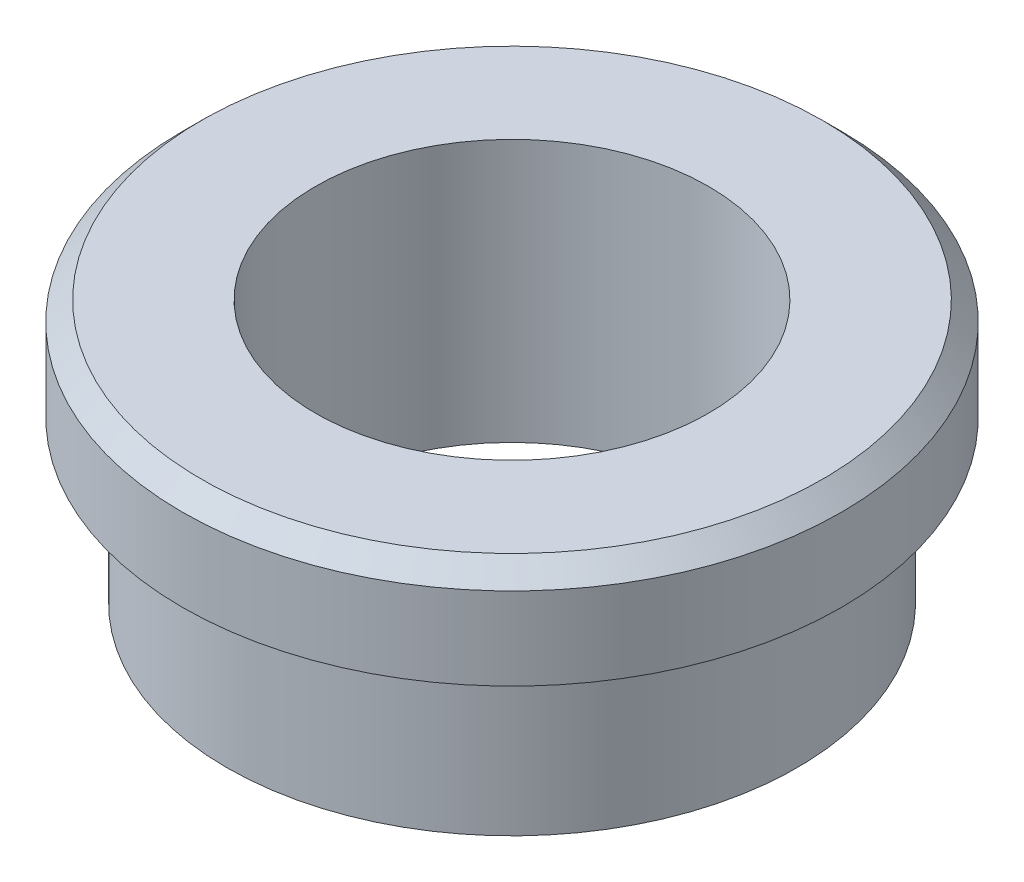
ISO-10303-21;
HEADER;
FILE_DESCRIPTION(('STEP AP214'),'2;1');
FILE_NAME('part.step','',(''),(''),'','','');
FILE_SCHEMA(('AUTOMOTIVE_DESIGN { 1 0 10303 214 1 1 1 1 }'));
ENDSEC;
DATA;
#1=APPLICATION_CONTEXT('core data for automotive mechanical design processes');
#2=APPLICATION_PROTOCOL_DEFINITION('international standard','automotive_design',2000,#1);
#3=PRODUCT_CONTEXT('',#1,'mechanical');
#4=PRODUCT('Part','Part','',(#3));
#5=PRODUCT_RELATED_PRODUCT_CATEGORY('part','',(#4));
#6=PRODUCT_DEFINITION_FORMATION('','',#4);
#7=PRODUCT_DEFINITION_CONTEXT('part definition',#1,'design');
#8=PRODUCT_DEFINITION('design','',#6,#7);
#9=PRODUCT_DEFINITION_SHAPE('','',#8);
#10=(LENGTH_UNIT() NAMED_UNIT(*) SI_UNIT(.MILLI.,.METRE.));
#11=(NAMED_UNIT(*) PLANE_ANGLE_UNIT() SI_UNIT($,.RADIAN.));
#12=(NAMED_UNIT(*) SI_UNIT($,.STERADIAN.) SOLID_ANGLE_UNIT());
#13=UNCERTAINTY_MEASURE_WITH_UNIT(LENGTH_MEASURE(1.E-05),#10,'distance_accuracy_value','');
#14=(GEOMETRIC_REPRESENTATION_CONTEXT(3) GLOBAL_UNCERTAINTY_ASSIGNED_CONTEXT((#13)) GLOBAL_UNIT_ASSIGNED_CONTEXT((#10,
#11,#12)) REPRESENTATION_CONTEXT('',''));
#15=CARTESIAN_POINT('',(0.,0.,0.));
#16=DIRECTION('',(0.,0.,1.));
#17=DIRECTION('',(1.,0.,0.));
#18=AXIS2_PLACEMENT_3D('',#15,#16,#17);
#19=CARTESIAN_POINT('',(22.5,0.,0.));
#20=DIRECTION('',(0.,-1.,0.));
#21=DIRECTION('',(0.,0.,-1.));
#22=AXIS2_PLACEMENT_3D('',#19,#20,#21);
#23=PLANE('',#22);
#24=CARTESIAN_POINT('',(0.,0.,0.));
#25=DIRECTION('',(0.,-1.,0.));
#26=DIRECTION('',(0.,0.,-1.));
#27=AXIS2_PLACEMENT_3D('',#24,#25,#26);
#28=CIRCLE('',#27,22.5);
#29=CARTESIAN_POINT('',(0.,0.,-22.5));
#30=VERTEX_POINT('',#29);
#31=EDGE_CURVE('E62',#30,#30,#28,.T.);
#32=ORIENTED_EDGE('',*,*,#31,.T.);
#33=EDGE_LOOP('',(#32));
#34=FACE_BOUND('',#33,.T.);
#35=CARTESIAN_POINT('',(0.,0.,0.));
#36=DIRECTION('',(0.,-1.,0.));
#37=DIRECTION('',(0.,0.,-1.));
#38=AXIS2_PLACEMENT_3D('',#35,#36,#37);
#39=CIRCLE('',#38,15.5);
#40=CARTESIAN_POINT('',(0.,0.,-15.5));
#41=VERTEX_POINT('',#40);
#42=EDGE_CURVE('E10',#41,#41,#39,.T.);
#43=ORIENTED_EDGE('',*,*,#42,.F.);
#44=EDGE_LOOP('',(#43));
#45=FACE_BOUND('',#44,.T.);
#46=ADVANCED_FACE('F37',(#34,#45),#23,.T.);
#47=CARTESIAN_POINT('',(0.,0.,0.));
#48=DIRECTION('',(0.,-1.,0.));
#49=DIRECTION('',(0.,0.,-1.));
#50=AXIS2_PLACEMENT_3D('',#47,#48,#49);
#51=CYLINDRICAL_SURFACE('',#50,15.5);
#52=ORIENTED_EDGE('',*,*,#42,.T.);
#53=EDGE_LOOP('',(#52));
#54=FACE_BOUND('',#53,.T.);
#55=CARTESIAN_POINT('',(0.,20.7,0.));
#56=DIRECTION('',(0.,-1.,0.));
#57=DIRECTION('',(0.,0.,-1.));
#58=AXIS2_PLACEMENT_3D('',#55,#56,#57);
#59=CIRCLE('',#58,15.5);
#60=CARTESIAN_POINT('',(0.,20.7,-15.5));
#61=VERTEX_POINT('',#60);
#62=EDGE_CURVE('E43',#61,#61,#59,.T.);
#63=ORIENTED_EDGE('',*,*,#62,.F.);
#64=EDGE_LOOP('',(#63));
#65=FACE_BOUND('',#64,.T.);
#66=ADVANCED_FACE('F80',(#54,#65),#51,.F.);
#67=CARTESIAN_POINT('',(15.5,20.7,0.));
#68=DIRECTION('',(0.,1.,0.));
#69=DIRECTION('',(0.,0.,1.));
#70=AXIS2_PLACEMENT_3D('',#67,#68,#69);
#71=PLANE('',#70);
#72=ORIENTED_EDGE('',*,*,#62,.T.);
#73=EDGE_LOOP('',(#72));
#74=FACE_BOUND('',#73,.T.);
#75=CARTESIAN_POINT('',(0.,20.7,0.));
#76=DIRECTION('',(0.,-1.,0.));
#77=DIRECTION('',(0.,0.,-1.));
#78=AXIS2_PLACEMENT_3D('',#75,#76,#77);
#79=CIRCLE('',#78,24.5);
#80=CARTESIAN_POINT('',(0.,20.7,-24.5));
#81=VERTEX_POINT('',#80);
#82=EDGE_CURVE('E47',#81,#81,#79,.T.);
#83=ORIENTED_EDGE('',*,*,#82,.F.);
#84=EDGE_LOOP('',(#83));
#85=FACE_BOUND('',#84,.T.);
#86=ADVANCED_FACE('F84',(#74,#85),#71,.T.);
#87=CARTESIAN_POINT('',(0.,19.2,0.));
#88=DIRECTION('',(0.,-1.,0.));
#89=DIRECTION('',(0.,0.,-1.));
#90=AXIS2_PLACEMENT_3D('',#87,#88,#89);
#91=CONICAL_SURFACE('',#90,26.,0.785398163397448);
#92=ORIENTED_EDGE('',*,*,#82,.T.);
#93=EDGE_LOOP('',(#92));
#94=FACE_BOUND('',#93,.T.);
#95=CARTESIAN_POINT('',(0.,19.2,0.));
#96=DIRECTION('',(0.,-1.,0.));
#97=DIRECTION('',(0.,0.,-1.));
#98=AXIS2_PLACEMENT_3D('',#95,#96,#97);
#99=CIRCLE('',#98,26.);
#100=CARTESIAN_POINT('',(0.,19.2,-26.));
#101=VERTEX_POINT('',#100);
#102=EDGE_CURVE('E51',#101,#101,#99,.T.);
#103=ORIENTED_EDGE('',*,*,#102,.F.);
#104=EDGE_LOOP('',(#103));
#105=FACE_BOUND('',#104,.T.);
#106=ADVANCED_FACE('F88',(#94,#105),#91,.T.);
#107=CARTESIAN_POINT('',(0.,0.,0.));
#108=DIRECTION('',(0.,-1.,0.));
#109=DIRECTION('',(0.,0.,-1.));
#110=AXIS2_PLACEMENT_3D('',#107,#108,#109);
#111=CYLINDRICAL_SURFACE('',#110,26.);
#112=ORIENTED_EDGE('',*,*,#102,.T.);
#113=EDGE_LOOP('',(#112));
#114=FACE_BOUND('',#113,.T.);
#115=CARTESIAN_POINT('',(0.,12.7,0.));
#116=DIRECTION('',(0.,-1.,0.));
#117=DIRECTION('',(0.,0.,-1.));
#118=AXIS2_PLACEMENT_3D('',#115,#116,#117);
#119=CIRCLE('',#118,26.);
#120=CARTESIAN_POINT('',(0.,12.7,-26.));
#121=VERTEX_POINT('',#120);
#122=EDGE_CURVE('E56',#121,#121,#119,.T.);
#123=ORIENTED_EDGE('',*,*,#122,.F.);
#124=EDGE_LOOP('',(#123));
#125=FACE_BOUND('',#124,.T.);
#126=ADVANCED_FACE('F76',(#114,#125),#111,.T.);
#127=CARTESIAN_POINT('',(26.,12.7,0.));
#128=DIRECTION('',(0.,-1.,0.));
#129=DIRECTION('',(0.,0.,-1.));
#130=AXIS2_PLACEMENT_3D('',#127,#128,#129);
#131=PLANE('',#130);
#132=ORIENTED_EDGE('',*,*,#122,.T.);
#133=EDGE_LOOP('',(#132));
#134=FACE_BOUND('',#133,.T.);
#135=CARTESIAN_POINT('',(0.,12.7,0.));
#136=DIRECTION('',(0.,-1.,0.));
#137=DIRECTION('',(0.,0.,-1.));
#138=AXIS2_PLACEMENT_3D('',#135,#136,#137);
#139=CIRCLE('',#138,22.5);
#140=CARTESIAN_POINT('',(0.,12.7,-22.5));
#141=VERTEX_POINT('',#140);
#142=EDGE_CURVE('E59',#141,#141,#139,.T.);
#143=ORIENTED_EDGE('',*,*,#142,.F.);
#144=EDGE_LOOP('',(#143));
#145=FACE_BOUND('',#144,.T.);
#146=ADVANCED_FACE('F70',(#134,#145),#131,.T.);
#147=CARTESIAN_POINT('',(0.,0.,0.));
#148=DIRECTION('',(0.,-1.,0.));
#149=DIRECTION('',(0.,0.,-1.));
#150=AXIS2_PLACEMENT_3D('',#147,#148,#149);
#151=CYLINDRICAL_SURFACE('',#150,22.5);
#152=ORIENTED_EDGE('',*,*,#142,.T.);
#153=EDGE_LOOP('',(#152));
#154=FACE_BOUND('',#153,.T.);
#155=ORIENTED_EDGE('',*,*,#31,.F.);
#156=EDGE_LOOP('',(#155));
#157=FACE_BOUND('',#156,.T.);
#158=ADVANCED_FACE('F68',(#154,#157),#151,.T.);
#159=CLOSED_SHELL('',(#46,#66,#86,#106,#126,#146,#158));
#160=MANIFOLD_SOLID_BREP('B2',#159);
#161=ADVANCED_BREP_SHAPE_REPRESENTATION('',(#18,#160),#14);
#162=SHAPE_DEFINITION_REPRESENTATION(#9,#161);
ENDSEC;
END-ISO-10303-21;
